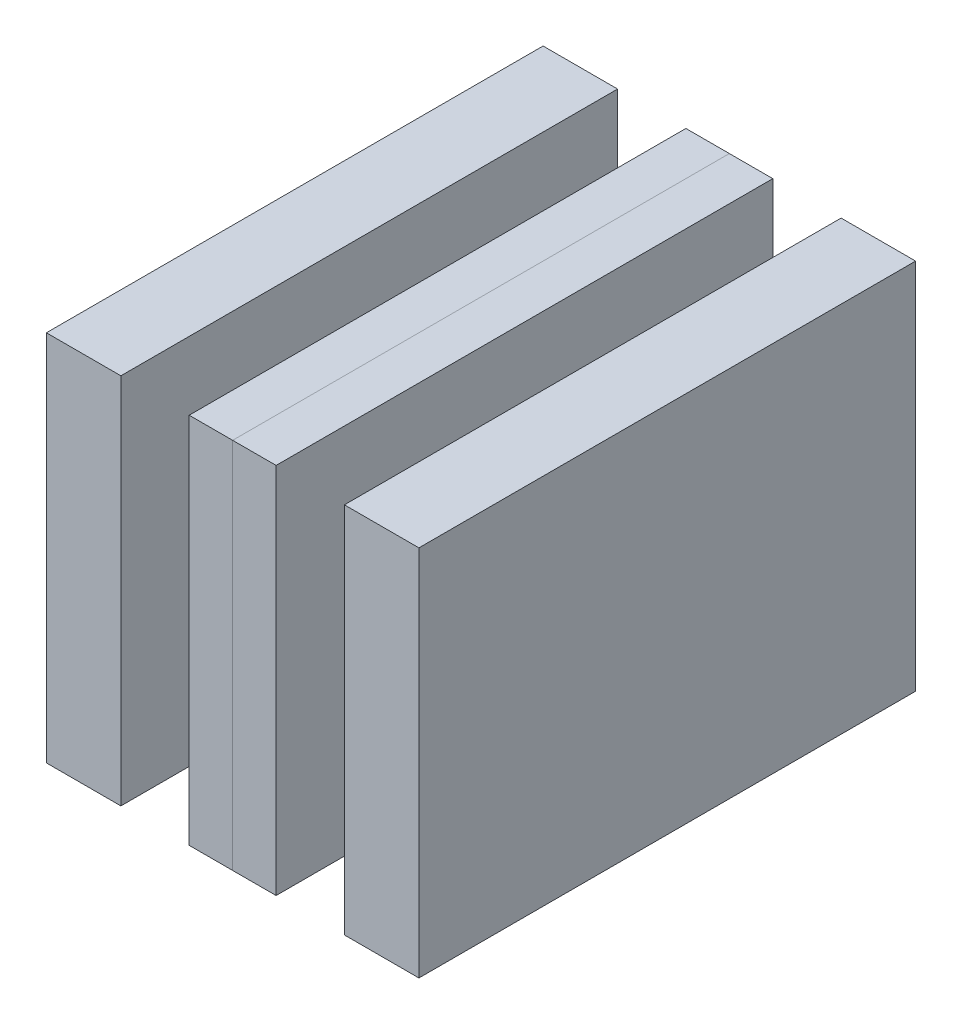
ISO-10303-21;
HEADER;
FILE_DESCRIPTION(('STEP AP214'),'2;1');
FILE_NAME('part.step','',(''),(''),'','','');
FILE_SCHEMA(('AUTOMOTIVE_DESIGN { 1 0 10303 214 1 1 1 1 }'));
ENDSEC;
DATA;
#1=APPLICATION_CONTEXT('core data for automotive mechanical design processes');
#2=APPLICATION_PROTOCOL_DEFINITION('international standard','automotive_design',2000,#1);
#3=PRODUCT_CONTEXT('',#1,'mechanical');
#4=PRODUCT('Part','Part','',(#3));
#5=PRODUCT_RELATED_PRODUCT_CATEGORY('part','',(#4));
#6=PRODUCT_DEFINITION_FORMATION('','',#4);
#7=PRODUCT_DEFINITION_CONTEXT('part definition',#1,'design');
#8=PRODUCT_DEFINITION('design','',#6,#7);
#9=PRODUCT_DEFINITION_SHAPE('','',#8);
#10=(LENGTH_UNIT() NAMED_UNIT(*) SI_UNIT(.MILLI.,.METRE.));
#11=(NAMED_UNIT(*) PLANE_ANGLE_UNIT() SI_UNIT($,.RADIAN.));
#12=(NAMED_UNIT(*) SI_UNIT($,.STERADIAN.) SOLID_ANGLE_UNIT());
#13=UNCERTAINTY_MEASURE_WITH_UNIT(LENGTH_MEASURE(1.E-05),#10,'distance_accuracy_value','');
#14=(GEOMETRIC_REPRESENTATION_CONTEXT(3) GLOBAL_UNCERTAINTY_ASSIGNED_CONTEXT((#13)) GLOBAL_UNIT_ASSIGNED_CONTEXT((#10,
#11,#12)) REPRESENTATION_CONTEXT('',''));
#15=CARTESIAN_POINT('',(0.,0.,0.));
#16=DIRECTION('',(0.,0.,1.));
#17=DIRECTION('',(1.,0.,0.));
#18=AXIS2_PLACEMENT_3D('',#15,#16,#17);
#19=CARTESIAN_POINT('',(15.,0.,20.));
#20=DIRECTION('',(-1.,0.,0.));
#21=DIRECTION('',(0.,0.,-1.));
#22=AXIS2_PLACEMENT_3D('',#19,#20,#21);
#23=PLANE('',#22);
#24=DIRECTION('',(0.,-1.,0.));
#25=VECTOR('',#24,1.);
#26=CARTESIAN_POINT('',(15.,0.,0.));
#27=LINE('',#26,#25);
#28=CARTESIAN_POINT('',(15.,15.,0.));
#29=VERTEX_POINT('',#28);
#30=CARTESIAN_POINT('',(15.,0.,0.));
#31=VERTEX_POINT('',#30);
#32=EDGE_CURVE('E107',#29,#31,#27,.T.);
#33=ORIENTED_EDGE('',*,*,#32,.F.);
#34=DIRECTION('',(0.,0.,-1.));
#35=VECTOR('',#34,1.);
#36=CARTESIAN_POINT('',(15.,15.,20.));
#37=LINE('',#36,#35);
#38=CARTESIAN_POINT('',(15.,15.,20.));
#39=VERTEX_POINT('',#38);
#40=EDGE_CURVE('E106',#39,#29,#37,.T.);
#41=ORIENTED_EDGE('',*,*,#40,.F.);
#42=DIRECTION('',(0.,-1.,0.));
#43=VECTOR('',#42,1.);
#44=CARTESIAN_POINT('',(15.,0.,20.));
#45=LINE('',#44,#43);
#46=CARTESIAN_POINT('',(15.,0.,20.));
#47=VERTEX_POINT('',#46);
#48=EDGE_CURVE('E101',#39,#47,#45,.T.);
#49=ORIENTED_EDGE('',*,*,#48,.T.);
#50=DIRECTION('',(0.,0.,-1.));
#51=VECTOR('',#50,1.);
#52=CARTESIAN_POINT('',(15.,0.,20.));
#53=LINE('',#52,#51);
#54=EDGE_CURVE('E12',#47,#31,#53,.T.);
#55=ORIENTED_EDGE('',*,*,#54,.T.);
#56=EDGE_LOOP('',(#33,#41,#49,#55));
#57=FACE_BOUND('',#56,.T.);
#58=ADVANCED_FACE('F44',(#57),#23,.F.);
#59=CARTESIAN_POINT('',(15.,0.,20.));
#60=DIRECTION('',(0.,1.,0.));
#61=DIRECTION('',(0.,0.,1.));
#62=AXIS2_PLACEMENT_3D('',#59,#60,#61);
#63=PLANE('',#62);
#64=DIRECTION('',(-1.,0.,0.));
#65=VECTOR('',#64,1.);
#66=CARTESIAN_POINT('',(15.,0.,0.));
#67=LINE('',#66,#65);
#68=CARTESIAN_POINT('',(12.,0.,0.));
#69=VERTEX_POINT('',#68);
#70=EDGE_CURVE('E109',#31,#69,#67,.T.);
#71=ORIENTED_EDGE('',*,*,#70,.F.);
#72=ORIENTED_EDGE('',*,*,#54,.F.);
#73=DIRECTION('',(-1.,0.,0.));
#74=VECTOR('',#73,1.);
#75=CARTESIAN_POINT('',(15.,0.,20.));
#76=LINE('',#75,#74);
#77=CARTESIAN_POINT('',(12.,0.,20.));
#78=VERTEX_POINT('',#77);
#79=EDGE_CURVE('E85',#47,#78,#76,.T.);
#80=ORIENTED_EDGE('',*,*,#79,.T.);
#81=DIRECTION('',(0.,0.,-1.));
#82=VECTOR('',#81,1.);
#83=CARTESIAN_POINT('',(12.,0.,20.));
#84=LINE('',#83,#82);
#85=EDGE_CURVE('E52',#78,#69,#84,.T.);
#86=ORIENTED_EDGE('',*,*,#85,.T.);
#87=EDGE_LOOP('',(#71,#72,#80,#86));
#88=FACE_BOUND('',#87,.T.);
#89=ADVANCED_FACE('F99',(#88),#63,.F.);
#90=CARTESIAN_POINT('',(12.,0.,20.));
#91=DIRECTION('',(1.,0.,0.));
#92=DIRECTION('',(0.,0.,1.));
#93=AXIS2_PLACEMENT_3D('',#90,#91,#92);
#94=PLANE('',#93);
#95=DIRECTION('',(0.,1.,0.));
#96=VECTOR('',#95,1.);
#97=CARTESIAN_POINT('',(12.,0.,0.));
#98=LINE('',#97,#96);
#99=CARTESIAN_POINT('',(12.,15.,0.));
#100=VERTEX_POINT('',#99);
#101=EDGE_CURVE('E95',#69,#100,#98,.T.);
#102=ORIENTED_EDGE('',*,*,#101,.F.);
#103=ORIENTED_EDGE('',*,*,#85,.F.);
#104=DIRECTION('',(0.,1.,0.));
#105=VECTOR('',#104,1.);
#106=CARTESIAN_POINT('',(12.,0.,20.));
#107=LINE('',#106,#105);
#108=CARTESIAN_POINT('',(12.,15.,20.));
#109=VERTEX_POINT('',#108);
#110=EDGE_CURVE('E88',#78,#109,#107,.T.);
#111=ORIENTED_EDGE('',*,*,#110,.T.);
#112=DIRECTION('',(0.,0.,-1.));
#113=VECTOR('',#112,1.);
#114=CARTESIAN_POINT('',(12.,15.,20.));
#115=LINE('',#114,#113);
#116=EDGE_CURVE('E98',#109,#100,#115,.T.);
#117=ORIENTED_EDGE('',*,*,#116,.T.);
#118=EDGE_LOOP('',(#102,#103,#111,#117));
#119=FACE_BOUND('',#118,.T.);
#120=ADVANCED_FACE('F94',(#119),#94,.F.);
#121=CARTESIAN_POINT('',(15.,15.,20.));
#122=DIRECTION('',(0.,-1.,0.));
#123=DIRECTION('',(0.,0.,-1.));
#124=AXIS2_PLACEMENT_3D('',#121,#122,#123);
#125=PLANE('',#124);
#126=DIRECTION('',(1.,0.,0.));
#127=VECTOR('',#126,1.);
#128=CARTESIAN_POINT('',(15.,15.,0.));
#129=LINE('',#128,#127);
#130=EDGE_CURVE('E74',#100,#29,#129,.T.);
#131=ORIENTED_EDGE('',*,*,#130,.F.);
#132=ORIENTED_EDGE('',*,*,#116,.F.);
#133=DIRECTION('',(1.,0.,0.));
#134=VECTOR('',#133,1.);
#135=CARTESIAN_POINT('',(15.,15.,20.));
#136=LINE('',#135,#134);
#137=EDGE_CURVE('E60',#109,#39,#136,.T.);
#138=ORIENTED_EDGE('',*,*,#137,.T.);
#139=ORIENTED_EDGE('',*,*,#40,.T.);
#140=EDGE_LOOP('',(#131,#132,#138,#139));
#141=FACE_BOUND('',#140,.T.);
#142=ADVANCED_FACE('F118',(#141),#125,.F.);
#143=CARTESIAN_POINT('',(15.,0.,20.));
#144=DIRECTION('',(0.,0.,-1.));
#145=DIRECTION('',(1.,0.,0.));
#146=AXIS2_PLACEMENT_3D('',#143,#144,#145);
#147=PLANE('',#146);
#148=ORIENTED_EDGE('',*,*,#48,.F.);
#149=ORIENTED_EDGE('',*,*,#137,.F.);
#150=ORIENTED_EDGE('',*,*,#110,.F.);
#151=ORIENTED_EDGE('',*,*,#79,.F.);
#152=EDGE_LOOP('',(#148,#149,#150,#151));
#153=FACE_BOUND('',#152,.T.);
#154=ADVANCED_FACE('F90',(#153),#147,.F.);
#155=CARTESIAN_POINT('',(15.,0.,0.));
#156=DIRECTION('',(0.,0.,-1.));
#157=DIRECTION('',(1.,0.,0.));
#158=AXIS2_PLACEMENT_3D('',#155,#156,#157);
#159=PLANE('',#158);
#160=ORIENTED_EDGE('',*,*,#32,.T.);
#161=ORIENTED_EDGE('',*,*,#70,.T.);
#162=ORIENTED_EDGE('',*,*,#101,.T.);
#163=ORIENTED_EDGE('',*,*,#130,.T.);
#164=EDGE_LOOP('',(#160,#161,#162,#163));
#165=FACE_BOUND('',#164,.T.);
#166=ADVANCED_FACE('F114',(#165),#159,.T.);
#167=CLOSED_SHELL('',(#58,#89,#120,#142,#154,#166));
#168=MANIFOLD_SOLID_BREP('B2',#167);
#169=CARTESIAN_POINT('',(9.25,15.,20.));
#170=DIRECTION('',(-1.,0.,0.));
#171=DIRECTION('',(0.,1.,0.));
#172=AXIS2_PLACEMENT_3D('',#169,#170,#171);
#173=PLANE('',#172);
#174=DIRECTION('',(0.,-1.,0.));
#175=VECTOR('',#174,1.);
#176=CARTESIAN_POINT('',(9.25,15.,0.));
#177=LINE('',#176,#175);
#178=CARTESIAN_POINT('',(9.25,15.,0.));
#179=VERTEX_POINT('',#178);
#180=CARTESIAN_POINT('',(9.25,0.,0.));
#181=VERTEX_POINT('',#180);
#182=EDGE_CURVE('E241',#179,#181,#177,.T.);
#183=ORIENTED_EDGE('',*,*,#182,.F.);
#184=DIRECTION('',(0.,0.,-1.));
#185=VECTOR('',#184,1.);
#186=CARTESIAN_POINT('',(9.25,15.,20.));
#187=LINE('',#186,#185);
#188=CARTESIAN_POINT('',(9.25,15.,20.));
#189=VERTEX_POINT('',#188);
#190=EDGE_CURVE('E240',#189,#179,#187,.T.);
#191=ORIENTED_EDGE('',*,*,#190,.F.);
#192=DIRECTION('',(0.,-1.,0.));
#193=VECTOR('',#192,1.);
#194=CARTESIAN_POINT('',(9.25,15.,20.));
#195=LINE('',#194,#193);
#196=CARTESIAN_POINT('',(9.25,0.,20.));
#197=VERTEX_POINT('',#196);
#198=EDGE_CURVE('E235',#189,#197,#195,.T.);
#199=ORIENTED_EDGE('',*,*,#198,.T.);
#200=DIRECTION('',(0.,0.,-1.));
#201=VECTOR('',#200,1.);
#202=CARTESIAN_POINT('',(9.25,0.,20.));
#203=LINE('',#202,#201);
#204=EDGE_CURVE('E42',#197,#181,#203,.T.);
#205=ORIENTED_EDGE('',*,*,#204,.T.);
#206=EDGE_LOOP('',(#183,#191,#199,#205));
#207=FACE_BOUND('',#206,.T.);
#208=ADVANCED_FACE('F178',(#207),#173,.F.);
#209=CARTESIAN_POINT('',(9.25,0.,20.));
#210=DIRECTION('',(0.,1.,0.));
#211=DIRECTION('',(0.,0.,1.));
#212=AXIS2_PLACEMENT_3D('',#209,#210,#211);
#213=PLANE('',#212);
#214=DIRECTION('',(-1.,0.,0.));
#215=VECTOR('',#214,1.);
#216=CARTESIAN_POINT('',(9.25,0.,0.));
#217=LINE('',#216,#215);
#218=CARTESIAN_POINT('',(7.5,0.,0.));
#219=VERTEX_POINT('',#218);
#220=EDGE_CURVE('E243',#181,#219,#217,.T.);
#221=ORIENTED_EDGE('',*,*,#220,.F.);
#222=ORIENTED_EDGE('',*,*,#204,.F.);
#223=DIRECTION('',(-1.,0.,0.));
#224=VECTOR('',#223,1.);
#225=CARTESIAN_POINT('',(9.25,0.,20.));
#226=LINE('',#225,#224);
#227=CARTESIAN_POINT('',(7.5,0.,20.));
#228=VERTEX_POINT('',#227);
#229=EDGE_CURVE('E219',#197,#228,#226,.T.);
#230=ORIENTED_EDGE('',*,*,#229,.T.);
#231=DIRECTION('',(0.,0.,-1.));
#232=VECTOR('',#231,1.);
#233=CARTESIAN_POINT('',(7.5,0.,20.));
#234=LINE('',#233,#232);
#235=EDGE_CURVE('E186',#228,#219,#234,.T.);
#236=ORIENTED_EDGE('',*,*,#235,.T.);
#237=EDGE_LOOP('',(#221,#222,#230,#236));
#238=FACE_BOUND('',#237,.T.);
#239=ADVANCED_FACE('F233',(#238),#213,.F.);
#240=CARTESIAN_POINT('',(7.5,15.,20.));
#241=DIRECTION('',(1.,0.,0.));
#242=DIRECTION('',(0.,-1.,0.));
#243=AXIS2_PLACEMENT_3D('',#240,#241,#242);
#244=PLANE('',#243);
#245=DIRECTION('',(0.,1.,0.));
#246=VECTOR('',#245,1.);
#247=CARTESIAN_POINT('',(7.5,15.,0.));
#248=LINE('',#247,#246);
#249=CARTESIAN_POINT('',(7.5,15.,0.));
#250=VERTEX_POINT('',#249);
#251=EDGE_CURVE('E229',#219,#250,#248,.T.);
#252=ORIENTED_EDGE('',*,*,#251,.F.);
#253=ORIENTED_EDGE('',*,*,#235,.F.);
#254=DIRECTION('',(0.,1.,0.));
#255=VECTOR('',#254,1.);
#256=CARTESIAN_POINT('',(7.5,15.,20.));
#257=LINE('',#256,#255);
#258=CARTESIAN_POINT('',(7.5,15.,20.));
#259=VERTEX_POINT('',#258);
#260=EDGE_CURVE('E222',#228,#259,#257,.T.);
#261=ORIENTED_EDGE('',*,*,#260,.T.);
#262=DIRECTION('',(0.,0.,-1.));
#263=VECTOR('',#262,1.);
#264=CARTESIAN_POINT('',(7.5,15.,20.));
#265=LINE('',#264,#263);
#266=EDGE_CURVE('E232',#259,#250,#265,.T.);
#267=ORIENTED_EDGE('',*,*,#266,.T.);
#268=EDGE_LOOP('',(#252,#253,#261,#267));
#269=FACE_BOUND('',#268,.T.);
#270=ADVANCED_FACE('F228',(#269),#244,.F.);
#271=CARTESIAN_POINT('',(9.25,15.,20.));
#272=DIRECTION('',(0.,-1.,0.));
#273=DIRECTION('',(0.,0.,-1.));
#274=AXIS2_PLACEMENT_3D('',#271,#272,#273);
#275=PLANE('',#274);
#276=DIRECTION('',(1.,0.,0.));
#277=VECTOR('',#276,1.);
#278=CARTESIAN_POINT('',(9.25,15.,0.));
#279=LINE('',#278,#277);
#280=EDGE_CURVE('E208',#250,#179,#279,.T.);
#281=ORIENTED_EDGE('',*,*,#280,.F.);
#282=ORIENTED_EDGE('',*,*,#266,.F.);
#283=DIRECTION('',(1.,0.,0.));
#284=VECTOR('',#283,1.);
#285=CARTESIAN_POINT('',(9.25,15.,20.));
#286=LINE('',#285,#284);
#287=EDGE_CURVE('E194',#259,#189,#286,.T.);
#288=ORIENTED_EDGE('',*,*,#287,.T.);
#289=ORIENTED_EDGE('',*,*,#190,.T.);
#290=EDGE_LOOP('',(#281,#282,#288,#289));
#291=FACE_BOUND('',#290,.T.);
#292=ADVANCED_FACE('F252',(#291),#275,.F.);
#293=CARTESIAN_POINT('',(15.,0.,20.));
#294=DIRECTION('',(0.,0.,1.));
#295=DIRECTION('',(-1.,0.,0.));
#296=AXIS2_PLACEMENT_3D('',#293,#294,#295);
#297=PLANE('',#296);
#298=ORIENTED_EDGE('',*,*,#198,.F.);
#299=ORIENTED_EDGE('',*,*,#287,.F.);
#300=ORIENTED_EDGE('',*,*,#260,.F.);
#301=ORIENTED_EDGE('',*,*,#229,.F.);
#302=EDGE_LOOP('',(#298,#299,#300,#301));
#303=FACE_BOUND('',#302,.T.);
#304=ADVANCED_FACE('F224',(#303),#297,.T.);
#305=CARTESIAN_POINT('',(15.,0.,0.));
#306=DIRECTION('',(0.,0.,1.));
#307=DIRECTION('',(-1.,0.,0.));
#308=AXIS2_PLACEMENT_3D('',#305,#306,#307);
#309=PLANE('',#308);
#310=ORIENTED_EDGE('',*,*,#182,.T.);
#311=ORIENTED_EDGE('',*,*,#220,.T.);
#312=ORIENTED_EDGE('',*,*,#251,.T.);
#313=ORIENTED_EDGE('',*,*,#280,.T.);
#314=EDGE_LOOP('',(#310,#311,#312,#313));
#315=FACE_BOUND('',#314,.T.);
#316=ADVANCED_FACE('F248',(#315),#309,.F.);
#317=CLOSED_SHELL('',(#208,#239,#270,#292,#304,#316));
#318=MANIFOLD_SOLID_BREP('B6',#317);
#319=CARTESIAN_POINT('',(5.75,15.,20.));
#320=DIRECTION('',(1.,0.,0.));
#321=DIRECTION('',(0.,1.,0.));
#322=AXIS2_PLACEMENT_3D('',#319,#320,#321);
#323=PLANE('',#322);
#324=DIRECTION('',(0.,-1.,0.));
#325=VECTOR('',#324,1.);
#326=CARTESIAN_POINT('',(5.75,15.,0.));
#327=LINE('',#326,#325);
#328=CARTESIAN_POINT('',(5.75,15.,0.));
#329=VERTEX_POINT('',#328);
#330=CARTESIAN_POINT('',(5.75,0.,0.));
#331=VERTEX_POINT('',#330);
#332=EDGE_CURVE('E374',#329,#331,#327,.T.);
#333=ORIENTED_EDGE('',*,*,#332,.T.);
#334=DIRECTION('',(0.,0.,-1.));
#335=VECTOR('',#334,1.);
#336=CARTESIAN_POINT('',(5.75,0.,20.));
#337=LINE('',#336,#335);
#338=CARTESIAN_POINT('',(5.75,0.,20.));
#339=VERTEX_POINT('',#338);
#340=EDGE_CURVE('E176',#339,#331,#337,.T.);
#341=ORIENTED_EDGE('',*,*,#340,.F.);
#342=DIRECTION('',(0.,-1.,0.));
#343=VECTOR('',#342,1.);
#344=CARTESIAN_POINT('',(5.75,15.,20.));
#345=LINE('',#344,#343);
#346=CARTESIAN_POINT('',(5.75,15.,20.));
#347=VERTEX_POINT('',#346);
#348=EDGE_CURVE('E362',#347,#339,#345,.T.);
#349=ORIENTED_EDGE('',*,*,#348,.F.);
#350=DIRECTION('',(0.,0.,-1.));
#351=VECTOR('',#350,1.);
#352=CARTESIAN_POINT('',(5.75,15.,20.));
#353=LINE('',#352,#351);
#354=EDGE_CURVE('E370',#347,#329,#353,.T.);
#355=ORIENTED_EDGE('',*,*,#354,.T.);
#356=EDGE_LOOP('',(#333,#341,#349,#355));
#357=FACE_BOUND('',#356,.T.);
#358=ADVANCED_FACE('F311',(#357),#323,.F.);
#359=CARTESIAN_POINT('',(5.75,0.,20.));
#360=DIRECTION('',(0.,1.,0.));
#361=DIRECTION('',(0.,0.,1.));
#362=AXIS2_PLACEMENT_3D('',#359,#360,#361);
#363=PLANE('',#362);
#364=DIRECTION('',(1.,0.,0.));
#365=VECTOR('',#364,1.);
#366=CARTESIAN_POINT('',(5.75,0.,0.));
#367=LINE('',#366,#365);
#368=CARTESIAN_POINT('',(7.5,0.,0.));
#369=VERTEX_POINT('',#368);
#370=EDGE_CURVE('E366',#331,#369,#367,.T.);
#371=ORIENTED_EDGE('',*,*,#370,.T.);
#372=DIRECTION('',(0.,0.,-1.));
#373=VECTOR('',#372,1.);
#374=CARTESIAN_POINT('',(7.5,0.,20.));
#375=LINE('',#374,#373);
#376=CARTESIAN_POINT('',(7.5,0.,20.));
#377=VERTEX_POINT('',#376);
#378=EDGE_CURVE('E319',#377,#369,#375,.T.);
#379=ORIENTED_EDGE('',*,*,#378,.F.);
#380=DIRECTION('',(1.,0.,0.));
#381=VECTOR('',#380,1.);
#382=CARTESIAN_POINT('',(5.75,0.,20.));
#383=LINE('',#382,#381);
#384=EDGE_CURVE('E357',#339,#377,#383,.T.);
#385=ORIENTED_EDGE('',*,*,#384,.F.);
#386=ORIENTED_EDGE('',*,*,#340,.T.);
#387=EDGE_LOOP('',(#371,#379,#385,#386));
#388=FACE_BOUND('',#387,.T.);
#389=ADVANCED_FACE('F365',(#388),#363,.F.);
#390=CARTESIAN_POINT('',(7.5,15.,20.));
#391=DIRECTION('',(-1.,0.,0.));
#392=DIRECTION('',(0.,-1.,0.));
#393=AXIS2_PLACEMENT_3D('',#390,#391,#392);
#394=PLANE('',#393);
#395=DIRECTION('',(0.,1.,0.));
#396=VECTOR('',#395,1.);
#397=CARTESIAN_POINT('',(7.5,15.,0.));
#398=LINE('',#397,#396);
#399=CARTESIAN_POINT('',(7.5,15.,0.));
#400=VERTEX_POINT('',#399);
#401=EDGE_CURVE('E344',#369,#400,#398,.T.);
#402=ORIENTED_EDGE('',*,*,#401,.T.);
#403=DIRECTION('',(0.,0.,-1.));
#404=VECTOR('',#403,1.);
#405=CARTESIAN_POINT('',(7.5,15.,20.));
#406=LINE('',#405,#404);
#407=CARTESIAN_POINT('',(7.5,15.,20.));
#408=VERTEX_POINT('',#407);
#409=EDGE_CURVE('E367',#408,#400,#406,.T.);
#410=ORIENTED_EDGE('',*,*,#409,.F.);
#411=DIRECTION('',(0.,1.,0.));
#412=VECTOR('',#411,1.);
#413=CARTESIAN_POINT('',(7.5,15.,20.));
#414=LINE('',#413,#412);
#415=EDGE_CURVE('E360',#377,#408,#414,.T.);
#416=ORIENTED_EDGE('',*,*,#415,.F.);
#417=ORIENTED_EDGE('',*,*,#378,.T.);
#418=EDGE_LOOP('',(#402,#410,#416,#417));
#419=FACE_BOUND('',#418,.T.);
#420=ADVANCED_FACE('F368',(#419),#394,.F.);
#421=CARTESIAN_POINT('',(5.75,15.,20.));
#422=DIRECTION('',(0.,-1.,0.));
#423=DIRECTION('',(0.,0.,-1.));
#424=AXIS2_PLACEMENT_3D('',#421,#422,#423);
#425=PLANE('',#424);
#426=DIRECTION('',(-1.,0.,0.));
#427=VECTOR('',#426,1.);
#428=CARTESIAN_POINT('',(5.75,15.,0.));
#429=LINE('',#428,#427);
#430=EDGE_CURVE('E350',#400,#329,#429,.T.);
#431=ORIENTED_EDGE('',*,*,#430,.T.);
#432=ORIENTED_EDGE('',*,*,#354,.F.);
#433=DIRECTION('',(-1.,0.,0.));
#434=VECTOR('',#433,1.);
#435=CARTESIAN_POINT('',(5.75,15.,20.));
#436=LINE('',#435,#434);
#437=EDGE_CURVE('E327',#408,#347,#436,.T.);
#438=ORIENTED_EDGE('',*,*,#437,.F.);
#439=ORIENTED_EDGE('',*,*,#409,.T.);
#440=EDGE_LOOP('',(#431,#432,#438,#439));
#441=FACE_BOUND('',#440,.T.);
#442=ADVANCED_FACE('F381',(#441),#425,.F.);
#443=CARTESIAN_POINT('',(0.,0.,20.));
#444=DIRECTION('',(0.,0.,1.));
#445=DIRECTION('',(1.,0.,0.));
#446=AXIS2_PLACEMENT_3D('',#443,#444,#445);
#447=PLANE('',#446);
#448=ORIENTED_EDGE('',*,*,#348,.T.);
#449=ORIENTED_EDGE('',*,*,#384,.T.);
#450=ORIENTED_EDGE('',*,*,#415,.T.);
#451=ORIENTED_EDGE('',*,*,#437,.T.);
#452=EDGE_LOOP('',(#448,#449,#450,#451));
#453=FACE_BOUND('',#452,.T.);
#454=ADVANCED_FACE('F358',(#453),#447,.T.);
#455=CARTESIAN_POINT('',(0.,0.,0.));
#456=DIRECTION('',(0.,0.,1.));
#457=DIRECTION('',(1.,0.,0.));
#458=AXIS2_PLACEMENT_3D('',#455,#456,#457);
#459=PLANE('',#458);
#460=ORIENTED_EDGE('',*,*,#332,.F.);
#461=ORIENTED_EDGE('',*,*,#430,.F.);
#462=ORIENTED_EDGE('',*,*,#401,.F.);
#463=ORIENTED_EDGE('',*,*,#370,.F.);
#464=EDGE_LOOP('',(#460,#461,#462,#463));
#465=FACE_BOUND('',#464,.T.);
#466=ADVANCED_FACE('F384',(#465),#459,.F.);
#467=CLOSED_SHELL('',(#358,#389,#420,#442,#454,#466));
#468=MANIFOLD_SOLID_BREP('B36',#467);
#469=CARTESIAN_POINT('',(0.,0.,20.));
#470=DIRECTION('',(1.,0.,0.));
#471=DIRECTION('',(0.,0.,-1.));
#472=AXIS2_PLACEMENT_3D('',#469,#470,#471);
#473=PLANE('',#472);
#474=DIRECTION('',(0.,-1.,0.));
#475=VECTOR('',#474,1.);
#476=CARTESIAN_POINT('',(0.,0.,0.));
#477=LINE('',#476,#475);
#478=CARTESIAN_POINT('',(0.,15.,0.));
#479=VERTEX_POINT('',#478);
#480=CARTESIAN_POINT('',(0.,0.,0.));
#481=VERTEX_POINT('',#480);
#482=EDGE_CURVE('E498',#479,#481,#477,.T.);
#483=ORIENTED_EDGE('',*,*,#482,.T.);
#484=DIRECTION('',(0.,0.,-1.));
#485=VECTOR('',#484,1.);
#486=CARTESIAN_POINT('',(0.,0.,20.));
#487=LINE('',#486,#485);
#488=CARTESIAN_POINT('',(0.,0.,20.));
#489=VERTEX_POINT('',#488);
#490=EDGE_CURVE('E309',#489,#481,#487,.T.);
#491=ORIENTED_EDGE('',*,*,#490,.F.);
#492=DIRECTION('',(0.,-1.,0.));
#493=VECTOR('',#492,1.);
#494=CARTESIAN_POINT('',(0.,0.,20.));
#495=LINE('',#494,#493);
#496=CARTESIAN_POINT('',(0.,15.,20.));
#497=VERTEX_POINT('',#496);
#498=EDGE_CURVE('E486',#497,#489,#495,.T.);
#499=ORIENTED_EDGE('',*,*,#498,.F.);
#500=DIRECTION('',(0.,0.,-1.));
#501=VECTOR('',#500,1.);
#502=CARTESIAN_POINT('',(0.,15.,20.));
#503=LINE('',#502,#501);
#504=EDGE_CURVE('E494',#497,#479,#503,.T.);
#505=ORIENTED_EDGE('',*,*,#504,.T.);
#506=EDGE_LOOP('',(#483,#491,#499,#505));
#507=FACE_BOUND('',#506,.T.);
#508=ADVANCED_FACE('F435',(#507),#473,.F.);
#509=CARTESIAN_POINT('',(0.,0.,20.));
#510=DIRECTION('',(0.,1.,0.));
#511=DIRECTION('',(0.,0.,1.));
#512=AXIS2_PLACEMENT_3D('',#509,#510,#511);
#513=PLANE('',#512);
#514=DIRECTION('',(1.,0.,0.));
#515=VECTOR('',#514,1.);
#516=CARTESIAN_POINT('',(0.,0.,0.));
#517=LINE('',#516,#515);
#518=CARTESIAN_POINT('',(3.,0.,0.));
#519=VERTEX_POINT('',#518);
#520=EDGE_CURVE('E490',#481,#519,#517,.T.);
#521=ORIENTED_EDGE('',*,*,#520,.T.);
#522=DIRECTION('',(0.,0.,-1.));
#523=VECTOR('',#522,1.);
#524=CARTESIAN_POINT('',(3.,0.,20.));
#525=LINE('',#524,#523);
#526=CARTESIAN_POINT('',(3.,0.,20.));
#527=VERTEX_POINT('',#526);
#528=EDGE_CURVE('E443',#527,#519,#525,.T.);
#529=ORIENTED_EDGE('',*,*,#528,.F.);
#530=DIRECTION('',(1.,0.,0.));
#531=VECTOR('',#530,1.);
#532=CARTESIAN_POINT('',(0.,0.,20.));
#533=LINE('',#532,#531);
#534=EDGE_CURVE('E481',#489,#527,#533,.T.);
#535=ORIENTED_EDGE('',*,*,#534,.F.);
#536=ORIENTED_EDGE('',*,*,#490,.T.);
#537=EDGE_LOOP('',(#521,#529,#535,#536));
#538=FACE_BOUND('',#537,.T.);
#539=ADVANCED_FACE('F489',(#538),#513,.F.);
#540=CARTESIAN_POINT('',(3.,0.,20.));
#541=DIRECTION('',(-1.,0.,0.));
#542=DIRECTION('',(0.,0.,1.));
#543=AXIS2_PLACEMENT_3D('',#540,#541,#542);
#544=PLANE('',#543);
#545=DIRECTION('',(0.,1.,0.));
#546=VECTOR('',#545,1.);
#547=CARTESIAN_POINT('',(3.,0.,0.));
#548=LINE('',#547,#546);
#549=CARTESIAN_POINT('',(3.,15.,0.));
#550=VERTEX_POINT('',#549);
#551=EDGE_CURVE('E468',#519,#550,#548,.T.);
#552=ORIENTED_EDGE('',*,*,#551,.T.);
#553=DIRECTION('',(0.,0.,-1.));
#554=VECTOR('',#553,1.);
#555=CARTESIAN_POINT('',(3.,15.,20.));
#556=LINE('',#555,#554);
#557=CARTESIAN_POINT('',(3.,15.,20.));
#558=VERTEX_POINT('',#557);
#559=EDGE_CURVE('E491',#558,#550,#556,.T.);
#560=ORIENTED_EDGE('',*,*,#559,.F.);
#561=DIRECTION('',(0.,1.,0.));
#562=VECTOR('',#561,1.);
#563=CARTESIAN_POINT('',(3.,0.,20.));
#564=LINE('',#563,#562);
#565=EDGE_CURVE('E484',#527,#558,#564,.T.);
#566=ORIENTED_EDGE('',*,*,#565,.F.);
#567=ORIENTED_EDGE('',*,*,#528,.T.);
#568=EDGE_LOOP('',(#552,#560,#566,#567));
#569=FACE_BOUND('',#568,.T.);
#570=ADVANCED_FACE('F492',(#569),#544,.F.);
#571=CARTESIAN_POINT('',(0.,15.,20.));
#572=DIRECTION('',(0.,-1.,0.));
#573=DIRECTION('',(0.,0.,-1.));
#574=AXIS2_PLACEMENT_3D('',#571,#572,#573);
#575=PLANE('',#574);
#576=DIRECTION('',(-1.,0.,0.));
#577=VECTOR('',#576,1.);
#578=CARTESIAN_POINT('',(0.,15.,0.));
#579=LINE('',#578,#577);
#580=EDGE_CURVE('E474',#550,#479,#579,.T.);
#581=ORIENTED_EDGE('',*,*,#580,.T.);
#582=ORIENTED_EDGE('',*,*,#504,.F.);
#583=DIRECTION('',(-1.,0.,0.));
#584=VECTOR('',#583,1.);
#585=CARTESIAN_POINT('',(0.,15.,20.));
#586=LINE('',#585,#584);
#587=EDGE_CURVE('E451',#558,#497,#586,.T.);
#588=ORIENTED_EDGE('',*,*,#587,.F.);
#589=ORIENTED_EDGE('',*,*,#559,.T.);
#590=EDGE_LOOP('',(#581,#582,#588,#589));
#591=FACE_BOUND('',#590,.T.);
#592=ADVANCED_FACE('F505',(#591),#575,.F.);
#593=CARTESIAN_POINT('',(0.,0.,20.));
#594=DIRECTION('',(0.,0.,-1.));
#595=DIRECTION('',(-1.,0.,0.));
#596=AXIS2_PLACEMENT_3D('',#593,#594,#595);
#597=PLANE('',#596);
#598=ORIENTED_EDGE('',*,*,#498,.T.);
#599=ORIENTED_EDGE('',*,*,#534,.T.);
#600=ORIENTED_EDGE('',*,*,#565,.T.);
#601=ORIENTED_EDGE('',*,*,#587,.T.);
#602=EDGE_LOOP('',(#598,#599,#600,#601));
#603=FACE_BOUND('',#602,.T.);
#604=ADVANCED_FACE('F482',(#603),#597,.F.);
#605=CARTESIAN_POINT('',(0.,0.,0.));
#606=DIRECTION('',(0.,0.,-1.));
#607=DIRECTION('',(-1.,0.,0.));
#608=AXIS2_PLACEMENT_3D('',#605,#606,#607);
#609=PLANE('',#608);
#610=ORIENTED_EDGE('',*,*,#482,.F.);
#611=ORIENTED_EDGE('',*,*,#580,.F.);
#612=ORIENTED_EDGE('',*,*,#551,.F.);
#613=ORIENTED_EDGE('',*,*,#520,.F.);
#614=EDGE_LOOP('',(#610,#611,#612,#613));
#615=FACE_BOUND('',#614,.T.);
#616=ADVANCED_FACE('F508',(#615),#609,.T.);
#617=CLOSED_SHELL('',(#508,#539,#570,#592,#604,#616));
#618=MANIFOLD_SOLID_BREP('B170',#617);
#619=ADVANCED_BREP_SHAPE_REPRESENTATION('',(#18,#168,#318,#468,#618),#14);
#620=SHAPE_DEFINITION_REPRESENTATION(#9,#619);
ENDSEC;
END-ISO-10303-21;
